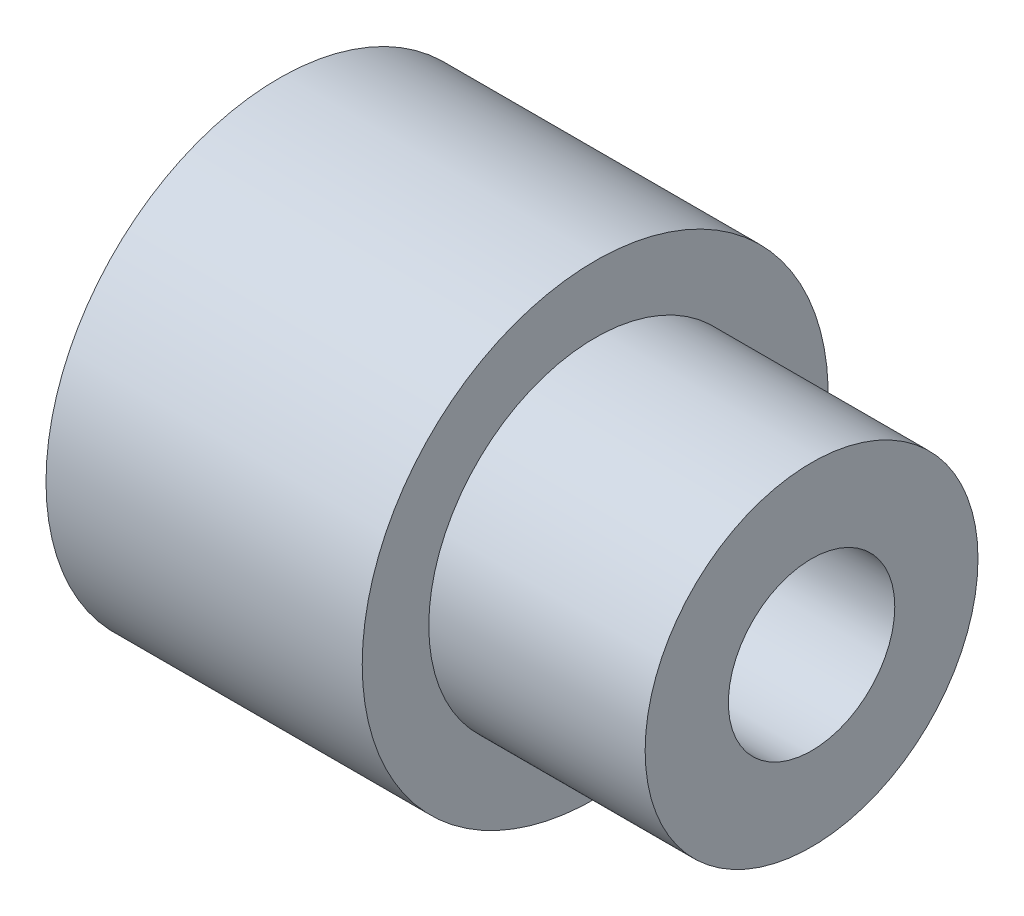
ISO-10303-21;
HEADER;
FILE_DESCRIPTION(('STEP AP214'),'2;1');
FILE_NAME('part.step','',(''),(''),'','','');
FILE_SCHEMA(('AUTOMOTIVE_DESIGN { 1 0 10303 214 1 1 1 1 }'));
ENDSEC;
DATA;
#1=APPLICATION_CONTEXT('core data for automotive mechanical design processes');
#2=APPLICATION_PROTOCOL_DEFINITION('international standard','automotive_design',2000,#1);
#3=PRODUCT_CONTEXT('',#1,'mechanical');
#4=PRODUCT('Part','Part','',(#3));
#5=PRODUCT_RELATED_PRODUCT_CATEGORY('part','',(#4));
#6=PRODUCT_DEFINITION_FORMATION('','',#4);
#7=PRODUCT_DEFINITION_CONTEXT('part definition',#1,'design');
#8=PRODUCT_DEFINITION('design','',#6,#7);
#9=PRODUCT_DEFINITION_SHAPE('','',#8);
#10=(LENGTH_UNIT() NAMED_UNIT(*) SI_UNIT(.MILLI.,.METRE.));
#11=(NAMED_UNIT(*) PLANE_ANGLE_UNIT() SI_UNIT($,.RADIAN.));
#12=(NAMED_UNIT(*) SI_UNIT($,.STERADIAN.) SOLID_ANGLE_UNIT());
#13=UNCERTAINTY_MEASURE_WITH_UNIT(LENGTH_MEASURE(1.E-05),#10,'distance_accuracy_value','');
#14=(GEOMETRIC_REPRESENTATION_CONTEXT(3) GLOBAL_UNCERTAINTY_ASSIGNED_CONTEXT((#13)) GLOBAL_UNIT_ASSIGNED_CONTEXT((#10,
#11,#12)) REPRESENTATION_CONTEXT('',''));
#15=CARTESIAN_POINT('',(0.,0.,0.));
#16=DIRECTION('',(0.,0.,1.));
#17=DIRECTION('',(1.,0.,0.));
#18=AXIS2_PLACEMENT_3D('',#15,#16,#17);
#19=CARTESIAN_POINT('',(-13.,0.,0.));
#20=DIRECTION('',(1.,0.,0.));
#21=DIRECTION('',(0.,0.,-1.));
#22=AXIS2_PLACEMENT_3D('',#19,#20,#21);
#23=CYLINDRICAL_SURFACE('',#22,10.);
#24=CARTESIAN_POINT('',(-13.,0.,0.));
#25=DIRECTION('',(-1.,0.,0.));
#26=DIRECTION('',(0.,0.,1.));
#27=AXIS2_PLACEMENT_3D('',#24,#25,#26);
#28=CIRCLE('',#27,10.);
#29=CARTESIAN_POINT('',(-13.,0.,-10.));
#30=VERTEX_POINT('',#29);
#31=EDGE_CURVE('E45',#30,#30,#28,.F.);
#32=CARTESIAN_POINT('',(0.,0.,0.));
#33=DIRECTION('',(1.,0.,0.));
#34=DIRECTION('',(0.,0.,-1.));
#35=AXIS2_PLACEMENT_3D('',#32,#33,#34);
#36=CIRCLE('',#35,10.);
#37=CARTESIAN_POINT('',(0.,0.,-10.));
#38=VERTEX_POINT('',#37);
#39=EDGE_CURVE('E41',#38,#38,#36,.T.);
#40=CARTESIAN_POINT('',(-13.,0.,-10.));
#41=CARTESIAN_POINT('',(-12.8645833333333,0.,-10.));
#42=CARTESIAN_POINT('',(-12.7291666666667,0.,-10.));
#43=CARTESIAN_POINT('',(-12.4583333333333,0.,-10.));
#44=CARTESIAN_POINT('',(-12.3229166666667,0.,-10.));
#45=CARTESIAN_POINT('',(-12.0520833333333,0.,-10.));
#46=CARTESIAN_POINT('',(-11.9166666666667,0.,-10.));
#47=CARTESIAN_POINT('',(-11.6458333333333,0.,-10.));
#48=CARTESIAN_POINT('',(-11.5104166666667,0.,-10.));
#49=CARTESIAN_POINT('',(-11.2395833333333,0.,-10.));
#50=CARTESIAN_POINT('',(-11.1041666666667,0.,-10.));
#51=CARTESIAN_POINT('',(-10.8333333333333,0.,-10.));
#52=CARTESIAN_POINT('',(-10.6979166666667,0.,-10.));
#53=CARTESIAN_POINT('',(-10.4270833333333,0.,-10.));
#54=CARTESIAN_POINT('',(-10.2916666666667,0.,-10.));
#55=CARTESIAN_POINT('',(-10.0208333333333,0.,-10.));
#56=CARTESIAN_POINT('',(-9.88541666666667,0.,-10.));
#57=CARTESIAN_POINT('',(-9.61458333333333,0.,-10.));
#58=CARTESIAN_POINT('',(-9.47916666666667,0.,-10.));
#59=CARTESIAN_POINT('',(-9.20833333333333,0.,-10.));
#60=CARTESIAN_POINT('',(-9.07291666666666,0.,-10.));
#61=CARTESIAN_POINT('',(-8.80208333333333,0.,-10.));
#62=CARTESIAN_POINT('',(-8.66666666666667,0.,-10.));
#63=CARTESIAN_POINT('',(-8.39583333333333,0.,-10.));
#64=CARTESIAN_POINT('',(-8.26041666666667,0.,-10.));
#65=CARTESIAN_POINT('',(-7.98958333333333,0.,-10.));
#66=CARTESIAN_POINT('',(-7.85416666666667,0.,-10.));
#67=CARTESIAN_POINT('',(-7.58333333333333,0.,-10.));
#68=CARTESIAN_POINT('',(-7.44791666666667,0.,-10.));
#69=CARTESIAN_POINT('',(-7.17708333333333,0.,-10.));
#70=CARTESIAN_POINT('',(-7.04166666666667,0.,-10.));
#71=CARTESIAN_POINT('',(-6.77083333333333,0.,-10.));
#72=CARTESIAN_POINT('',(-6.63541666666667,0.,-10.));
#73=CARTESIAN_POINT('',(-6.36458333333333,0.,-10.));
#74=CARTESIAN_POINT('',(-6.22916666666667,0.,-10.));
#75=CARTESIAN_POINT('',(-5.95833333333333,0.,-10.));
#76=CARTESIAN_POINT('',(-5.82291666666667,0.,-10.));
#77=CARTESIAN_POINT('',(-5.55208333333333,0.,-10.));
#78=CARTESIAN_POINT('',(-5.41666666666667,0.,-10.));
#79=CARTESIAN_POINT('',(-5.14583333333333,0.,-10.));
#80=CARTESIAN_POINT('',(-5.01041666666667,0.,-10.));
#81=CARTESIAN_POINT('',(-4.73958333333333,0.,-10.));
#82=CARTESIAN_POINT('',(-4.60416666666667,0.,-10.));
#83=CARTESIAN_POINT('',(-4.33333333333333,0.,-10.));
#84=CARTESIAN_POINT('',(-4.19791666666667,0.,-10.));
#85=CARTESIAN_POINT('',(-3.92708333333333,0.,-10.));
#86=CARTESIAN_POINT('',(-3.79166666666667,0.,-10.));
#87=CARTESIAN_POINT('',(-3.52083333333333,0.,-10.));
#88=CARTESIAN_POINT('',(-3.38541666666667,0.,-10.));
#89=CARTESIAN_POINT('',(-3.11458333333333,0.,-10.));
#90=CARTESIAN_POINT('',(-2.97916666666667,0.,-10.));
#91=CARTESIAN_POINT('',(-2.70833333333333,0.,-10.));
#92=CARTESIAN_POINT('',(-2.57291666666667,0.,-10.));
#93=CARTESIAN_POINT('',(-2.30208333333333,0.,-10.));
#94=CARTESIAN_POINT('',(-2.16666666666667,0.,-10.));
#95=CARTESIAN_POINT('',(-1.89583333333333,0.,-10.));
#96=CARTESIAN_POINT('',(-1.76041666666667,0.,-10.));
#97=CARTESIAN_POINT('',(-1.48958333333333,0.,-10.));
#98=CARTESIAN_POINT('',(-1.35416666666667,0.,-10.));
#99=CARTESIAN_POINT('',(-1.08333333333333,0.,-10.));
#100=CARTESIAN_POINT('',(-0.947916666666667,0.,-10.));
#101=CARTESIAN_POINT('',(-0.677083333333334,0.,-10.));
#102=CARTESIAN_POINT('',(-0.541666666666667,0.,-10.));
#103=CARTESIAN_POINT('',(-0.270833333333334,0.,-10.));
#104=CARTESIAN_POINT('',(-0.135416666666667,0.,-10.));
#105=CARTESIAN_POINT('',(0.,0.,-10.));
#106=B_SPLINE_CURVE_WITH_KNOTS('',3,(#40,#41,#42,#43,#44,#45,#46,#47,#48,#49,#50,#51,#52,#53,
#54,#55,#56,#57,#58,#59,#60,#61,#62,#63,#64,#65,#66,#67,#68,#69,#70,#71,#72,#73,#74,#75,#76,#77,
#78,#79,#80,#81,#82,#83,#84,#85,#86,#87,#88,#89,#90,#91,#92,#93,#94,#95,#96,#97,#98,#99,#100,
#101,#102,#103,#104,#105),.UNSPECIFIED.,.F.,.F.,(4,2,2,2,2,2,2,2,2,2,2,2,2,2,2,2,2,2,2,2,2,2,2,
2,2,2,2,2,2,2,2,2,4),(0.,0.40625,0.812500000000001,1.21875,1.625,2.03125,2.4375,2.84375,3.25,
3.65625,4.0625,4.46875,4.875,5.28125,5.6875,6.09375,6.5,6.90625,7.3125,7.71875,8.125,8.53125,
8.9375,9.34375,9.75,10.15625,10.5625,10.96875,11.375,11.78125,12.1875,12.59375,13.),.UNSPECIFIED.);
#107=EDGE_CURVE('BSEAM30',#30,#38,#106,.T.);
#108=ORIENTED_EDGE('',*,*,#31,.T.);
#109=ORIENTED_EDGE('',*,*,#39,.F.);
#110=ORIENTED_EDGE('',*,*,#107,.T.);
#111=ORIENTED_EDGE('',*,*,#107,.F.);
#112=EDGE_LOOP('',(#108,#110,#109,#111));
#113=FACE_BOUND('',#112,.T.);
#114=ADVANCED_FACE('F30',(#113),#23,.T.);
#115=CARTESIAN_POINT('',(0.,0.,0.));
#116=DIRECTION('',(1.,0.,0.));
#117=DIRECTION('',(0.,0.,-1.));
#118=AXIS2_PLACEMENT_3D('',#115,#116,#117);
#119=PLANE('',#118);
#120=CARTESIAN_POINT('',(0.,0.,0.));
#121=DIRECTION('',(1.,0.,0.));
#122=DIRECTION('',(0.,0.,-1.));
#123=AXIS2_PLACEMENT_3D('',#120,#121,#122);
#124=CIRCLE('',#123,5.);
#125=CARTESIAN_POINT('',(0.,0.,-5.));
#126=VERTEX_POINT('',#125);
#127=EDGE_CURVE('E51',#126,#126,#124,.T.);
#128=ORIENTED_EDGE('',*,*,#127,.F.);
#129=EDGE_LOOP('',(#128));
#130=FACE_BOUND('',#129,.T.);
#131=ORIENTED_EDGE('',*,*,#39,.T.);
#132=EDGE_LOOP('',(#131));
#133=FACE_BOUND('',#132,.T.);
#134=ADVANCED_FACE('F74',(#130,#133),#119,.T.);
#135=CARTESIAN_POINT('',(-32.,0.,0.));
#136=DIRECTION('',(1.,0.,0.));
#137=DIRECTION('',(0.,0.,-1.));
#138=AXIS2_PLACEMENT_3D('',#135,#136,#137);
#139=CYLINDRICAL_SURFACE('',#138,14.);
#140=CARTESIAN_POINT('',(-32.,0.,0.));
#141=DIRECTION('',(-1.,0.,0.));
#142=DIRECTION('',(0.,0.,1.));
#143=AXIS2_PLACEMENT_3D('',#140,#141,#142);
#144=CIRCLE('',#143,14.);
#145=CARTESIAN_POINT('',(-32.,0.,14.));
#146=VERTEX_POINT('',#145);
#147=EDGE_CURVE('E55',#146,#146,#144,.T.);
#148=ORIENTED_EDGE('',*,*,#147,.F.);
#149=EDGE_LOOP('',(#148));
#150=FACE_BOUND('',#149,.T.);
#151=CARTESIAN_POINT('',(-13.,0.,0.));
#152=DIRECTION('',(-1.,0.,0.));
#153=DIRECTION('',(0.,0.,1.));
#154=AXIS2_PLACEMENT_3D('',#151,#152,#153);
#155=CIRCLE('',#154,14.);
#156=CARTESIAN_POINT('',(-13.,0.,14.));
#157=VERTEX_POINT('',#156);
#158=EDGE_CURVE('E56',#157,#157,#155,.T.);
#159=ORIENTED_EDGE('',*,*,#158,.T.);
#160=EDGE_LOOP('',(#159));
#161=FACE_BOUND('',#160,.T.);
#162=ADVANCED_FACE('F77',(#150,#161),#139,.T.);
#163=CARTESIAN_POINT('',(-32.,0.,0.));
#164=DIRECTION('',(-1.,0.,0.));
#165=DIRECTION('',(0.,0.,1.));
#166=AXIS2_PLACEMENT_3D('',#163,#164,#165);
#167=PLANE('',#166);
#168=CARTESIAN_POINT('',(-32.,0.,0.));
#169=DIRECTION('',(-1.,0.,0.));
#170=DIRECTION('',(0.,0.,1.));
#171=AXIS2_PLACEMENT_3D('',#168,#169,#170);
#172=CIRCLE('',#171,11.05);
#173=CARTESIAN_POINT('',(-32.,0.,11.05));
#174=VERTEX_POINT('',#173);
#175=EDGE_CURVE('E10',#174,#174,#172,.F.);
#176=ORIENTED_EDGE('',*,*,#175,.T.);
#177=EDGE_LOOP('',(#176));
#178=FACE_BOUND('',#177,.T.);
#179=ORIENTED_EDGE('',*,*,#147,.T.);
#180=EDGE_LOOP('',(#179));
#181=FACE_BOUND('',#180,.T.);
#182=ADVANCED_FACE('F88',(#178,#181),#167,.T.);
#183=CARTESIAN_POINT('',(-13.,0.,0.));
#184=DIRECTION('',(-1.,0.,0.));
#185=DIRECTION('',(0.,0.,1.));
#186=AXIS2_PLACEMENT_3D('',#183,#184,#185);
#187=PLANE('',#186);
#188=ORIENTED_EDGE('',*,*,#31,.F.);
#189=EDGE_LOOP('',(#188));
#190=FACE_BOUND('',#189,.T.);
#191=ORIENTED_EDGE('',*,*,#158,.F.);
#192=EDGE_LOOP('',(#191));
#193=FACE_BOUND('',#192,.T.);
#194=ADVANCED_FACE('F90',(#190,#193),#187,.F.);
#195=CARTESIAN_POINT('',(-26.,0.,0.));
#196=DIRECTION('',(-1.,0.,0.));
#197=DIRECTION('',(0.,0.,1.));
#198=AXIS2_PLACEMENT_3D('',#195,#196,#197);
#199=CYLINDRICAL_SURFACE('',#198,11.);
#200=CARTESIAN_POINT('',(-31.95,0.,0.));
#201=DIRECTION('',(-1.,0.,0.));
#202=DIRECTION('',(0.,0.,1.));
#203=AXIS2_PLACEMENT_3D('',#200,#201,#202);
#204=CIRCLE('',#203,11.);
#205=CARTESIAN_POINT('',(-31.95,0.,11.));
#206=VERTEX_POINT('',#205);
#207=EDGE_CURVE('E37',#206,#206,#204,.T.);
#208=ORIENTED_EDGE('',*,*,#207,.T.);
#209=EDGE_LOOP('',(#208));
#210=FACE_BOUND('',#209,.T.);
#211=CARTESIAN_POINT('',(-26.,0.,0.));
#212=DIRECTION('',(-1.,0.,0.));
#213=DIRECTION('',(0.,0.,1.));
#214=AXIS2_PLACEMENT_3D('',#211,#212,#213);
#215=CIRCLE('',#214,11.);
#216=CARTESIAN_POINT('',(-26.,0.,11.));
#217=VERTEX_POINT('',#216);
#218=EDGE_CURVE('E59',#217,#217,#215,.T.);
#219=ORIENTED_EDGE('',*,*,#218,.F.);
#220=EDGE_LOOP('',(#219));
#221=FACE_BOUND('',#220,.T.);
#222=ADVANCED_FACE('F93',(#210,#221),#199,.F.);
#223=CARTESIAN_POINT('',(-26.,0.,0.));
#224=DIRECTION('',(-1.,0.,0.));
#225=DIRECTION('',(0.,0.,1.));
#226=AXIS2_PLACEMENT_3D('',#223,#224,#225);
#227=PLANE('',#226);
#228=CARTESIAN_POINT('',(-26.,0.,0.));
#229=DIRECTION('',(-1.,0.,0.));
#230=DIRECTION('',(0.,0.,1.));
#231=AXIS2_PLACEMENT_3D('',#228,#229,#230);
#232=CIRCLE('',#231,9.);
#233=CARTESIAN_POINT('',(-26.,0.,9.));
#234=VERTEX_POINT('',#233);
#235=EDGE_CURVE('E50',#234,#234,#232,.T.);
#236=ORIENTED_EDGE('',*,*,#235,.F.);
#237=EDGE_LOOP('',(#236));
#238=FACE_BOUND('',#237,.T.);
#239=ORIENTED_EDGE('',*,*,#218,.T.);
#240=EDGE_LOOP('',(#239));
#241=FACE_BOUND('',#240,.T.);
#242=ADVANCED_FACE('F99',(#238,#241),#227,.T.);
#243=CARTESIAN_POINT('',(-16.,0.,0.));
#244=DIRECTION('',(-1.,0.,0.));
#245=DIRECTION('',(0.,0.,1.));
#246=AXIS2_PLACEMENT_3D('',#243,#244,#245);
#247=CYLINDRICAL_SURFACE('',#246,9.);
#248=CARTESIAN_POINT('',(-16.,0.,0.));
#249=DIRECTION('',(-1.,0.,0.));
#250=DIRECTION('',(0.,0.,1.));
#251=AXIS2_PLACEMENT_3D('',#248,#249,#250);
#252=CIRCLE('',#251,9.);
#253=CARTESIAN_POINT('',(-16.,0.,9.));
#254=VERTEX_POINT('',#253);
#255=EDGE_CURVE('E64',#254,#254,#252,.T.);
#256=ORIENTED_EDGE('',*,*,#255,.F.);
#257=EDGE_LOOP('',(#256));
#258=FACE_BOUND('',#257,.T.);
#259=ORIENTED_EDGE('',*,*,#235,.T.);
#260=EDGE_LOOP('',(#259));
#261=FACE_BOUND('',#260,.T.);
#262=ADVANCED_FACE('F102',(#258,#261),#247,.F.);
#263=CARTESIAN_POINT('',(-16.,0.,0.));
#264=DIRECTION('',(-1.,0.,0.));
#265=DIRECTION('',(0.,0.,1.));
#266=AXIS2_PLACEMENT_3D('',#263,#264,#265);
#267=PLANE('',#266);
#268=CARTESIAN_POINT('',(-16.,0.,0.));
#269=DIRECTION('',(-1.,0.,0.));
#270=DIRECTION('',(0.,0.,1.));
#271=AXIS2_PLACEMENT_3D('',#268,#269,#270);
#272=CIRCLE('',#271,5.);
#273=CARTESIAN_POINT('',(-16.,0.,5.));
#274=VERTEX_POINT('',#273);
#275=EDGE_CURVE('E48',#274,#274,#272,.T.);
#276=ORIENTED_EDGE('',*,*,#275,.F.);
#277=EDGE_LOOP('',(#276));
#278=FACE_BOUND('',#277,.T.);
#279=ORIENTED_EDGE('',*,*,#255,.T.);
#280=EDGE_LOOP('',(#279));
#281=FACE_BOUND('',#280,.T.);
#282=ADVANCED_FACE('F106',(#278,#281),#267,.T.);
#283=CARTESIAN_POINT('',(-32.,0.,0.));
#284=DIRECTION('',(1.,0.,0.));
#285=DIRECTION('',(0.,0.,-1.));
#286=AXIS2_PLACEMENT_3D('',#283,#284,#285);
#287=CYLINDRICAL_SURFACE('',#286,5.);
#288=ORIENTED_EDGE('',*,*,#275,.T.);
#289=EDGE_LOOP('',(#288));
#290=FACE_BOUND('',#289,.T.);
#291=ORIENTED_EDGE('',*,*,#127,.T.);
#292=EDGE_LOOP('',(#291));
#293=FACE_BOUND('',#292,.T.);
#294=ADVANCED_FACE('F72',(#290,#293),#287,.F.);
#295=CARTESIAN_POINT('',(-31.95,0.,0.));
#296=DIRECTION('',(-1.,0.,0.));
#297=DIRECTION('',(0.,0.,1.));
#298=AXIS2_PLACEMENT_3D('',#295,#296,#297);
#299=TOROIDAL_SURFACE('',#298,11.05,0.05);
#300=ORIENTED_EDGE('',*,*,#175,.F.);
#301=EDGE_LOOP('',(#300));
#302=FACE_BOUND('',#301,.T.);
#303=ORIENTED_EDGE('',*,*,#207,.F.);
#304=EDGE_LOOP('',(#303));
#305=FACE_BOUND('',#304,.T.);
#306=ADVANCED_FACE('F32',(#302,#305),#299,.T.);
#307=CLOSED_SHELL('',(#114,#134,#162,#182,#194,#222,#242,#262,#282,#294,#306));
#308=MANIFOLD_SOLID_BREP('B2',#307);
#309=ADVANCED_BREP_SHAPE_REPRESENTATION('',(#18,#308),#14);
#310=SHAPE_DEFINITION_REPRESENTATION(#9,#309);
ENDSEC;
END-ISO-10303-21;
